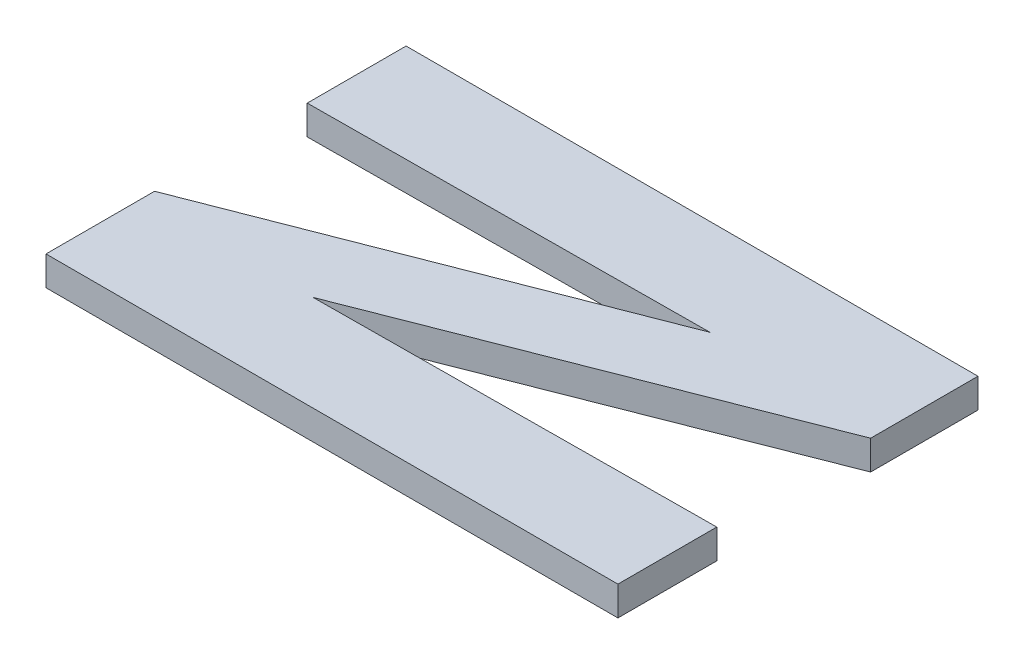
ISO-10303-21;
HEADER;
FILE_DESCRIPTION(('STEP AP214'),'2;1');
FILE_NAME('part.step','',(''),(''),'','','');
FILE_SCHEMA(('AUTOMOTIVE_DESIGN { 1 0 10303 214 1 1 1 1 }'));
ENDSEC;
DATA;
#1=APPLICATION_CONTEXT('core data for automotive mechanical design processes');
#2=APPLICATION_PROTOCOL_DEFINITION('international standard','automotive_design',2000,#1);
#3=PRODUCT_CONTEXT('',#1,'mechanical');
#4=PRODUCT('Part','Part','',(#3));
#5=PRODUCT_RELATED_PRODUCT_CATEGORY('part','',(#4));
#6=PRODUCT_DEFINITION_FORMATION('','',#4);
#7=PRODUCT_DEFINITION_CONTEXT('part definition',#1,'design');
#8=PRODUCT_DEFINITION('design','',#6,#7);
#9=PRODUCT_DEFINITION_SHAPE('','',#8);
#10=(LENGTH_UNIT() NAMED_UNIT(*) SI_UNIT(.MILLI.,.METRE.));
#11=(NAMED_UNIT(*) PLANE_ANGLE_UNIT() SI_UNIT($,.RADIAN.));
#12=(NAMED_UNIT(*) SI_UNIT($,.STERADIAN.) SOLID_ANGLE_UNIT());
#13=UNCERTAINTY_MEASURE_WITH_UNIT(LENGTH_MEASURE(1.E-05),#10,'distance_accuracy_value','');
#14=(GEOMETRIC_REPRESENTATION_CONTEXT(3) GLOBAL_UNCERTAINTY_ASSIGNED_CONTEXT((#13)) GLOBAL_UNIT_ASSIGNED_CONTEXT((#10,
#11,#12)) REPRESENTATION_CONTEXT('',''));
#15=CARTESIAN_POINT('',(0.,0.,0.));
#16=DIRECTION('',(0.,0.,1.));
#17=DIRECTION('',(1.,0.,0.));
#18=AXIS2_PLACEMENT_3D('',#15,#16,#17);
#19=CARTESIAN_POINT('',(2.3542541336,2.9906,5.8619335628332));
#20=DIRECTION('',(1.,0.,0.));
#21=DIRECTION('',(0.,-1.,0.));
#22=AXIS2_PLACEMENT_3D('',#19,#20,#21);
#23=PLANE('',#22);
#24=DIRECTION('',(0.,0.,1.));
#25=VECTOR('',#24,1.);
#26=CARTESIAN_POINT('',(2.3542541336,2.9306,5.8619335628332));
#27=LINE('',#26,#25);
#28=CARTESIAN_POINT('',(2.3542541336,2.9306,5.8619335628332));
#29=VERTEX_POINT('',#28);
#30=CARTESIAN_POINT('',(2.3542541336,2.9306,6.0641557850555));
#31=VERTEX_POINT('',#30);
#32=EDGE_CURVE('E11',#29,#31,#27,.T.);
#33=ORIENTED_EDGE('',*,*,#32,.F.);
#34=DIRECTION('',(0.,-1.,0.));
#35=VECTOR('',#34,1.);
#36=CARTESIAN_POINT('',(2.3542541336,2.9906,5.8619335628332));
#37=LINE('',#36,#35);
#38=CARTESIAN_POINT('',(2.3542541336,2.9906,5.8619335628332));
#39=VERTEX_POINT('',#38);
#40=EDGE_CURVE('E24',#39,#29,#37,.T.);
#41=ORIENTED_EDGE('',*,*,#40,.F.);
#42=DIRECTION('',(0.,0.,1.));
#43=VECTOR('',#42,1.);
#44=CARTESIAN_POINT('',(2.3542541336,2.9906,5.8619335628332));
#45=LINE('',#44,#43);
#46=CARTESIAN_POINT('',(2.3542541336,2.9906,6.0641557850555));
#47=VERTEX_POINT('',#46);
#48=EDGE_CURVE('E179',#39,#47,#45,.T.);
#49=ORIENTED_EDGE('',*,*,#48,.T.);
#50=DIRECTION('',(0.,-1.,0.));
#51=VECTOR('',#50,1.);
#52=CARTESIAN_POINT('',(2.3542541336,2.9906,6.0641557850555));
#53=LINE('',#52,#51);
#54=EDGE_CURVE('E114',#47,#31,#53,.T.);
#55=ORIENTED_EDGE('',*,*,#54,.T.);
#56=EDGE_LOOP('',(#33,#41,#49,#55));
#57=FACE_BOUND('',#56,.T.);
#58=ADVANCED_FACE('F17',(#57),#23,.T.);
#59=CARTESIAN_POINT('',(1.5345319113777,2.9906,5.8680273128332));
#60=DIRECTION('',(-0.0074337153023212,0.,-0.999972369556681));
#61=DIRECTION('',(-0.999972369556681,0.,0.0074337153023212));
#62=AXIS2_PLACEMENT_3D('',#59,#60,#61);
#63=PLANE('',#62);
#64=DIRECTION('',(0.999972369556681,0.,-0.0074337153023212));
#65=VECTOR('',#64,1.);
#66=CARTESIAN_POINT('',(1.5345319113777,2.9306,5.8680273128332));
#67=LINE('',#66,#65);
#68=CARTESIAN_POINT('',(1.5345319113777,2.9306,5.8680273128332));
#69=VERTEX_POINT('',#68);
#70=EDGE_CURVE('E176',#69,#29,#67,.T.);
#71=ORIENTED_EDGE('',*,*,#70,.F.);
#72=DIRECTION('',(0.,-1.,0.));
#73=VECTOR('',#72,1.);
#74=CARTESIAN_POINT('',(1.5345319113777,2.9906,5.8680273128332));
#75=LINE('',#74,#73);
#76=CARTESIAN_POINT('',(1.5345319113777,2.9906,5.8680273128332));
#77=VERTEX_POINT('',#76);
#78=EDGE_CURVE('E173',#77,#69,#75,.T.);
#79=ORIENTED_EDGE('',*,*,#78,.F.);
#80=DIRECTION('',(0.999972369556681,0.,-0.0074337153023212));
#81=VECTOR('',#80,1.);
#82=CARTESIAN_POINT('',(1.5345319113777,2.9906,5.8680273128332));
#83=LINE('',#82,#81);
#84=EDGE_CURVE('E170',#77,#39,#83,.T.);
#85=ORIENTED_EDGE('',*,*,#84,.T.);
#86=ORIENTED_EDGE('',*,*,#40,.T.);
#87=EDGE_LOOP('',(#71,#79,#85,#86));
#88=FACE_BOUND('',#87,.T.);
#89=ADVANCED_FACE('F181',(#88),#63,.T.);
#90=CARTESIAN_POINT('',(2.3542541336,2.9906,5.5470898128332));
#91=DIRECTION('',(0.364573344853378,0.,0.931174675462354));
#92=DIRECTION('',(0.931174675462354,0.,-0.364573344853378));
#93=AXIS2_PLACEMENT_3D('',#90,#91,#92);
#94=PLANE('',#93);
#95=DIRECTION('',(-0.931174675462354,0.,0.364573344853378));
#96=VECTOR('',#95,1.);
#97=CARTESIAN_POINT('',(2.3542541336,2.9306,5.5470898128332));
#98=LINE('',#97,#96);
#99=CARTESIAN_POINT('',(2.3542541336,2.9306,5.5470898128332));
#100=VERTEX_POINT('',#99);
#101=EDGE_CURVE('E167',#100,#69,#98,.T.);
#102=ORIENTED_EDGE('',*,*,#101,.F.);
#103=DIRECTION('',(0.,-1.,0.));
#104=VECTOR('',#103,1.);
#105=CARTESIAN_POINT('',(2.3542541336,2.9906,5.5470898128332));
#106=LINE('',#105,#104);
#107=CARTESIAN_POINT('',(2.3542541336,2.9906,5.5470898128332));
#108=VERTEX_POINT('',#107);
#109=EDGE_CURVE('E164',#108,#100,#106,.T.);
#110=ORIENTED_EDGE('',*,*,#109,.F.);
#111=DIRECTION('',(-0.931174675462354,0.,0.364573344853378));
#112=VECTOR('',#111,1.);
#113=CARTESIAN_POINT('',(2.3542541336,2.9906,5.5470898128332));
#114=LINE('',#113,#112);
#115=EDGE_CURVE('E161',#108,#77,#114,.T.);
#116=ORIENTED_EDGE('',*,*,#115,.T.);
#117=ORIENTED_EDGE('',*,*,#78,.T.);
#118=EDGE_LOOP('',(#102,#110,#116,#117));
#119=FACE_BOUND('',#118,.T.);
#120=ADVANCED_FACE('F185',(#119),#94,.T.);
#121=CARTESIAN_POINT('',(2.3542541336,2.9906,5.3274891183888));
#122=DIRECTION('',(1.,0.,0.));
#123=DIRECTION('',(0.,-1.,0.));
#124=AXIS2_PLACEMENT_3D('',#121,#122,#123);
#125=PLANE('',#124);
#126=DIRECTION('',(0.,0.,1.));
#127=VECTOR('',#126,1.);
#128=CARTESIAN_POINT('',(2.3542541336,2.9306,5.3274891183888));
#129=LINE('',#128,#127);
#130=CARTESIAN_POINT('',(2.3542541336,2.9306,5.3274891183888));
#131=VERTEX_POINT('',#130);
#132=EDGE_CURVE('E158',#131,#100,#129,.T.);
#133=ORIENTED_EDGE('',*,*,#132,.F.);
#134=DIRECTION('',(0.,-1.,0.));
#135=VECTOR('',#134,1.);
#136=CARTESIAN_POINT('',(2.3542541336,2.9906,5.3274891183888));
#137=LINE('',#136,#135);
#138=CARTESIAN_POINT('',(2.3542541336,2.9906,5.3274891183888));
#139=VERTEX_POINT('',#138);
#140=EDGE_CURVE('E155',#139,#131,#137,.T.);
#141=ORIENTED_EDGE('',*,*,#140,.F.);
#142=DIRECTION('',(0.,0.,1.));
#143=VECTOR('',#142,1.);
#144=CARTESIAN_POINT('',(2.3542541336,2.9906,5.3274891183888));
#145=LINE('',#144,#143);
#146=EDGE_CURVE('E152',#139,#108,#145,.T.);
#147=ORIENTED_EDGE('',*,*,#146,.T.);
#148=ORIENTED_EDGE('',*,*,#109,.T.);
#149=EDGE_LOOP('',(#133,#141,#147,#148));
#150=FACE_BOUND('',#149,.T.);
#151=ADVANCED_FACE('F188',(#150),#125,.T.);
#152=CARTESIAN_POINT('',(1.1842541336,2.9906,5.3274891183888));
#153=DIRECTION('',(0.,0.,-1.));
#154=DIRECTION('',(0.,1.,0.));
#155=AXIS2_PLACEMENT_3D('',#152,#153,#154);
#156=PLANE('',#155);
#157=DIRECTION('',(1.,0.,0.));
#158=VECTOR('',#157,1.);
#159=CARTESIAN_POINT('',(1.1842541336,2.9306,5.3274891183888));
#160=LINE('',#159,#158);
#161=CARTESIAN_POINT('',(1.1842541336,2.9306,5.3274891183888));
#162=VERTEX_POINT('',#161);
#163=EDGE_CURVE('E149',#162,#131,#160,.T.);
#164=ORIENTED_EDGE('',*,*,#163,.F.);
#165=DIRECTION('',(0.,-1.,0.));
#166=VECTOR('',#165,1.);
#167=CARTESIAN_POINT('',(1.1842541336,2.9906,5.3274891183888));
#168=LINE('',#167,#166);
#169=CARTESIAN_POINT('',(1.1842541336,2.9906,5.3274891183888));
#170=VERTEX_POINT('',#169);
#171=EDGE_CURVE('E146',#170,#162,#168,.T.);
#172=ORIENTED_EDGE('',*,*,#171,.F.);
#173=DIRECTION('',(1.,0.,0.));
#174=VECTOR('',#173,1.);
#175=CARTESIAN_POINT('',(1.1842541336,2.9906,5.3274891183888));
#176=LINE('',#175,#174);
#177=EDGE_CURVE('E143',#170,#139,#176,.T.);
#178=ORIENTED_EDGE('',*,*,#177,.T.);
#179=ORIENTED_EDGE('',*,*,#140,.T.);
#180=EDGE_LOOP('',(#164,#172,#178,#179));
#181=FACE_BOUND('',#180,.T.);
#182=ADVANCED_FACE('F193',(#181),#156,.T.);
#183=CARTESIAN_POINT('',(1.1842541336,2.9906,5.529711340611));
#184=DIRECTION('',(-1.,0.,0.));
#185=DIRECTION('',(0.,1.,0.));
#186=AXIS2_PLACEMENT_3D('',#183,#184,#185);
#187=PLANE('',#186);
#188=DIRECTION('',(0.,0.,-1.));
#189=VECTOR('',#188,1.);
#190=CARTESIAN_POINT('',(1.1842541336,2.9306,5.529711340611));
#191=LINE('',#190,#189);
#192=CARTESIAN_POINT('',(1.1842541336,2.9306,5.529711340611));
#193=VERTEX_POINT('',#192);
#194=EDGE_CURVE('E140',#193,#162,#191,.T.);
#195=ORIENTED_EDGE('',*,*,#194,.F.);
#196=DIRECTION('',(0.,-1.,0.));
#197=VECTOR('',#196,1.);
#198=CARTESIAN_POINT('',(1.1842541336,2.9906,5.529711340611));
#199=LINE('',#198,#197);
#200=CARTESIAN_POINT('',(1.1842541336,2.9906,5.529711340611));
#201=VERTEX_POINT('',#200);
#202=EDGE_CURVE('E137',#201,#193,#199,.T.);
#203=ORIENTED_EDGE('',*,*,#202,.F.);
#204=DIRECTION('',(0.,0.,-1.));
#205=VECTOR('',#204,1.);
#206=CARTESIAN_POINT('',(1.1842541336,2.9906,5.529711340611));
#207=LINE('',#206,#205);
#208=EDGE_CURVE('E134',#201,#170,#207,.T.);
#209=ORIENTED_EDGE('',*,*,#208,.T.);
#210=ORIENTED_EDGE('',*,*,#171,.T.);
#211=EDGE_LOOP('',(#195,#203,#209,#210));
#212=FACE_BOUND('',#211,.T.);
#213=ADVANCED_FACE('F195',(#212),#187,.T.);
#214=CARTESIAN_POINT('',(2.0023964947111,2.9906,5.5238432850555));
#215=DIRECTION('',(0.0071722293131156,0.,0.999974279232561));
#216=DIRECTION('',(0.999974279232561,0.,-0.0071722293131156));
#217=AXIS2_PLACEMENT_3D('',#214,#215,#216);
#218=PLANE('',#217);
#219=DIRECTION('',(-0.999974279232561,0.,0.0071722293131156));
#220=VECTOR('',#219,1.);
#221=CARTESIAN_POINT('',(2.0023964947111,2.9306,5.5238432850555));
#222=LINE('',#221,#220);
#223=CARTESIAN_POINT('',(2.0023964947111,2.9306,5.5238432850555));
#224=VERTEX_POINT('',#223);
#225=EDGE_CURVE('E131',#224,#193,#222,.T.);
#226=ORIENTED_EDGE('',*,*,#225,.F.);
#227=DIRECTION('',(0.,-1.,0.));
#228=VECTOR('',#227,1.);
#229=CARTESIAN_POINT('',(2.0023964947111,2.9906,5.5238432850555));
#230=LINE('',#229,#228);
#231=CARTESIAN_POINT('',(2.0023964947111,2.9906,5.5238432850555));
#232=VERTEX_POINT('',#231);
#233=EDGE_CURVE('E128',#232,#224,#230,.T.);
#234=ORIENTED_EDGE('',*,*,#233,.F.);
#235=DIRECTION('',(-0.999974279232561,0.,0.0071722293131156));
#236=VECTOR('',#235,1.);
#237=CARTESIAN_POINT('',(2.0023964947111,2.9906,5.5238432850555));
#238=LINE('',#237,#236);
#239=EDGE_CURVE('E125',#232,#201,#238,.T.);
#240=ORIENTED_EDGE('',*,*,#239,.T.);
#241=ORIENTED_EDGE('',*,*,#202,.T.);
#242=EDGE_LOOP('',(#226,#234,#240,#241));
#243=FACE_BOUND('',#242,.T.);
#244=ADVANCED_FACE('F197',(#243),#218,.T.);
#245=CARTESIAN_POINT('',(1.1842541336,2.9906,5.8420724517221));
#246=DIRECTION('',(-0.362508294741692,0.,-0.931980544991939));
#247=DIRECTION('',(-0.931980544991939,0.,0.362508294741692));
#248=AXIS2_PLACEMENT_3D('',#245,#246,#247);
#249=PLANE('',#248);
#250=DIRECTION('',(0.931980544991939,0.,-0.362508294741692));
#251=VECTOR('',#250,1.);
#252=CARTESIAN_POINT('',(1.1842541336,2.9306,5.8420724517221));
#253=LINE('',#252,#251);
#254=CARTESIAN_POINT('',(1.1842541336,2.9306,5.8420724517221));
#255=VERTEX_POINT('',#254);
#256=EDGE_CURVE('E122',#255,#224,#253,.T.);
#257=ORIENTED_EDGE('',*,*,#256,.F.);
#258=DIRECTION('',(0.,-1.,0.));
#259=VECTOR('',#258,1.);
#260=CARTESIAN_POINT('',(1.1842541336,2.9906,5.8420724517221));
#261=LINE('',#260,#259);
#262=CARTESIAN_POINT('',(1.1842541336,2.9906,5.8420724517221));
#263=VERTEX_POINT('',#262);
#264=EDGE_CURVE('E120',#263,#255,#261,.T.);
#265=ORIENTED_EDGE('',*,*,#264,.F.);
#266=DIRECTION('',(0.931980544991939,0.,-0.362508294741692));
#267=VECTOR('',#266,1.);
#268=CARTESIAN_POINT('',(1.1842541336,2.9906,5.8420724517221));
#269=LINE('',#268,#267);
#270=EDGE_CURVE('E109',#263,#232,#269,.T.);
#271=ORIENTED_EDGE('',*,*,#270,.T.);
#272=ORIENTED_EDGE('',*,*,#233,.T.);
#273=EDGE_LOOP('',(#257,#265,#271,#272));
#274=FACE_BOUND('',#273,.T.);
#275=ADVANCED_FACE('F199',(#274),#249,.T.);
#276=CARTESIAN_POINT('',(1.1842541336,2.9906,6.0641557850555));
#277=DIRECTION('',(-1.,0.,0.));
#278=DIRECTION('',(0.,1.,0.));
#279=AXIS2_PLACEMENT_3D('',#276,#277,#278);
#280=PLANE('',#279);
#281=DIRECTION('',(0.,0.,-1.));
#282=VECTOR('',#281,1.);
#283=CARTESIAN_POINT('',(1.1842541336,2.9306,6.0641557850555));
#284=LINE('',#283,#282);
#285=CARTESIAN_POINT('',(1.1842541336,2.9306,6.0641557850555));
#286=VERTEX_POINT('',#285);
#287=EDGE_CURVE('E96',#286,#255,#284,.T.);
#288=ORIENTED_EDGE('',*,*,#287,.F.);
#289=DIRECTION('',(0.,-1.,0.));
#290=VECTOR('',#289,1.);
#291=CARTESIAN_POINT('',(1.1842541336,2.9906,6.0641557850555));
#292=LINE('',#291,#290);
#293=CARTESIAN_POINT('',(1.1842541336,2.9906,6.0641557850555));
#294=VERTEX_POINT('',#293);
#295=EDGE_CURVE('E90',#294,#286,#292,.T.);
#296=ORIENTED_EDGE('',*,*,#295,.F.);
#297=DIRECTION('',(0.,0.,-1.));
#298=VECTOR('',#297,1.);
#299=CARTESIAN_POINT('',(1.1842541336,2.9906,6.0641557850555));
#300=LINE('',#299,#298);
#301=EDGE_CURVE('E94',#294,#263,#300,.T.);
#302=ORIENTED_EDGE('',*,*,#301,.T.);
#303=ORIENTED_EDGE('',*,*,#264,.T.);
#304=EDGE_LOOP('',(#288,#296,#302,#303));
#305=FACE_BOUND('',#304,.T.);
#306=ADVANCED_FACE('F92',(#305),#280,.T.);
#307=CARTESIAN_POINT('',(2.3542541336,2.9906,6.0641557850555));
#308=DIRECTION('',(0.,0.,1.));
#309=DIRECTION('',(0.,-1.,0.));
#310=AXIS2_PLACEMENT_3D('',#307,#308,#309);
#311=PLANE('',#310);
#312=DIRECTION('',(-1.,0.,0.));
#313=VECTOR('',#312,1.);
#314=CARTESIAN_POINT('',(2.3542541336,2.9306,6.0641557850555));
#315=LINE('',#314,#313);
#316=EDGE_CURVE('E110',#31,#286,#315,.T.);
#317=ORIENTED_EDGE('',*,*,#316,.F.);
#318=ORIENTED_EDGE('',*,*,#54,.F.);
#319=DIRECTION('',(-1.,0.,0.));
#320=VECTOR('',#319,1.);
#321=CARTESIAN_POINT('',(2.3542541336,2.9906,6.0641557850555));
#322=LINE('',#321,#320);
#323=EDGE_CURVE('E106',#47,#294,#322,.T.);
#324=ORIENTED_EDGE('',*,*,#323,.T.);
#325=ORIENTED_EDGE('',*,*,#295,.T.);
#326=EDGE_LOOP('',(#317,#318,#324,#325));
#327=FACE_BOUND('',#326,.T.);
#328=ADVANCED_FACE('F113',(#327),#311,.T.);
#329=CARTESIAN_POINT('',(0.,2.9906,0.));
#330=DIRECTION('',(0.,-1.,0.));
#331=DIRECTION('',(-1.,0.,0.));
#332=AXIS2_PLACEMENT_3D('',#329,#330,#331);
#333=PLANE('',#332);
#334=ORIENTED_EDGE('',*,*,#48,.F.);
#335=ORIENTED_EDGE('',*,*,#84,.F.);
#336=ORIENTED_EDGE('',*,*,#115,.F.);
#337=ORIENTED_EDGE('',*,*,#146,.F.);
#338=ORIENTED_EDGE('',*,*,#177,.F.);
#339=ORIENTED_EDGE('',*,*,#208,.F.);
#340=ORIENTED_EDGE('',*,*,#239,.F.);
#341=ORIENTED_EDGE('',*,*,#270,.F.);
#342=ORIENTED_EDGE('',*,*,#301,.F.);
#343=ORIENTED_EDGE('',*,*,#323,.F.);
#344=EDGE_LOOP('',(#334,#335,#336,#337,#338,#339,#340,#341,#342,#343));
#345=FACE_BOUND('',#344,.T.);
#346=ADVANCED_FACE('F105',(#345),#333,.F.);
#347=CARTESIAN_POINT('',(0.,2.9306,0.));
#348=DIRECTION('',(0.,-1.,0.));
#349=DIRECTION('',(-1.,0.,0.));
#350=AXIS2_PLACEMENT_3D('',#347,#348,#349);
#351=PLANE('',#350);
#352=ORIENTED_EDGE('',*,*,#32,.T.);
#353=ORIENTED_EDGE('',*,*,#316,.T.);
#354=ORIENTED_EDGE('',*,*,#287,.T.);
#355=ORIENTED_EDGE('',*,*,#256,.T.);
#356=ORIENTED_EDGE('',*,*,#225,.T.);
#357=ORIENTED_EDGE('',*,*,#194,.T.);
#358=ORIENTED_EDGE('',*,*,#163,.T.);
#359=ORIENTED_EDGE('',*,*,#132,.T.);
#360=ORIENTED_EDGE('',*,*,#101,.T.);
#361=ORIENTED_EDGE('',*,*,#70,.T.);
#362=EDGE_LOOP('',(#352,#353,#354,#355,#356,#357,#358,#359,#360,#361));
#363=FACE_BOUND('',#362,.T.);
#364=ADVANCED_FACE('F183',(#363),#351,.T.);
#365=CLOSED_SHELL('',(#58,#89,#120,#151,#182,#213,#244,#275,#306,#328,#346,#364));
#366=MANIFOLD_SOLID_BREP('B1',#365);
#367=ADVANCED_BREP_SHAPE_REPRESENTATION('',(#18,#366),#14);
#368=SHAPE_DEFINITION_REPRESENTATION(#9,#367);
ENDSEC;
END-ISO-10303-21;
